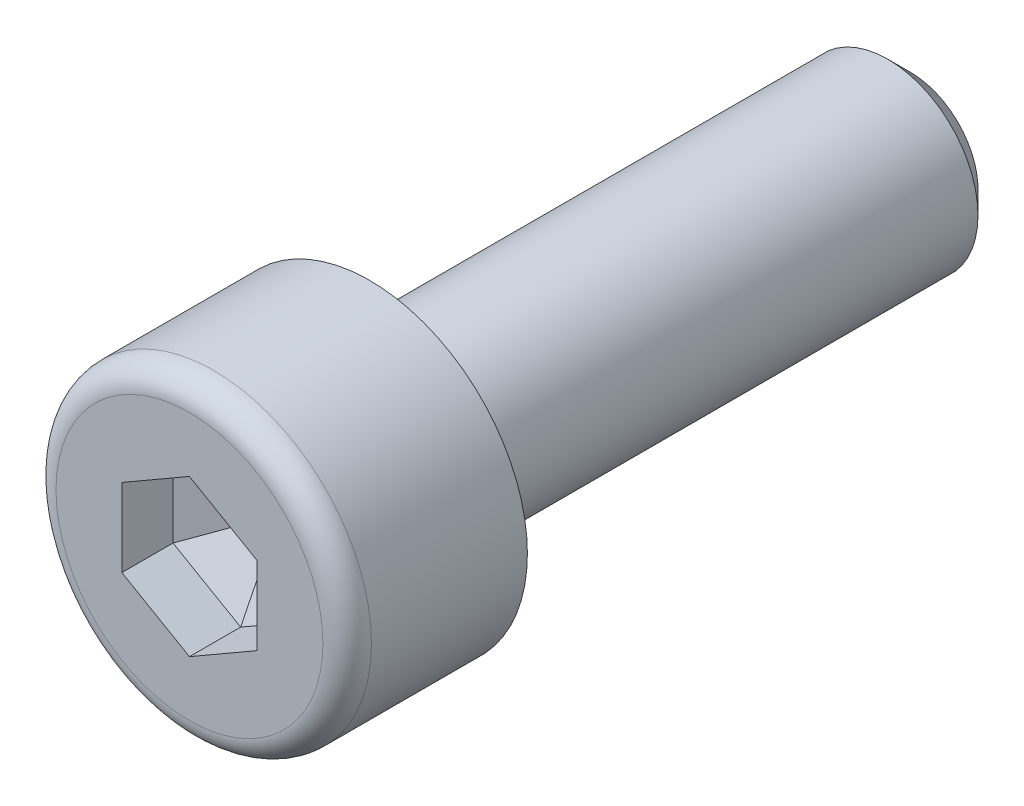
ISO-10303-21;
HEADER;
FILE_DESCRIPTION(('STEP AP214'),'2;1');
FILE_NAME('part.step','',(''),(''),'','','');
FILE_SCHEMA(('AUTOMOTIVE_DESIGN { 1 0 10303 214 1 1 1 1 }'));
ENDSEC;
DATA;
#1=APPLICATION_CONTEXT('core data for automotive mechanical design processes');
#2=APPLICATION_PROTOCOL_DEFINITION('international standard','automotive_design',2000,#1);
#3=PRODUCT_CONTEXT('',#1,'mechanical');
#4=PRODUCT('Part','Part','',(#3));
#5=PRODUCT_RELATED_PRODUCT_CATEGORY('part','',(#4));
#6=PRODUCT_DEFINITION_FORMATION('','',#4);
#7=PRODUCT_DEFINITION_CONTEXT('part definition',#1,'design');
#8=PRODUCT_DEFINITION('design','',#6,#7);
#9=PRODUCT_DEFINITION_SHAPE('','',#8);
#10=(LENGTH_UNIT() NAMED_UNIT(*) SI_UNIT(.MILLI.,.METRE.));
#11=(NAMED_UNIT(*) PLANE_ANGLE_UNIT() SI_UNIT($,.RADIAN.));
#12=(NAMED_UNIT(*) SI_UNIT($,.STERADIAN.) SOLID_ANGLE_UNIT());
#13=UNCERTAINTY_MEASURE_WITH_UNIT(LENGTH_MEASURE(1.E-05),#10,'distance_accuracy_value','');
#14=(GEOMETRIC_REPRESENTATION_CONTEXT(3) GLOBAL_UNCERTAINTY_ASSIGNED_CONTEXT((#13)) GLOBAL_UNIT_ASSIGNED_CONTEXT((#10,
#11,#12)) REPRESENTATION_CONTEXT('',''));
#15=CARTESIAN_POINT('',(0.,0.,0.));
#16=DIRECTION('',(0.,0.,1.));
#17=DIRECTION('',(1.,0.,0.));
#18=AXIS2_PLACEMENT_3D('',#15,#16,#17);
#19=CARTESIAN_POINT('',(0.,0.,0.));
#20=DIRECTION('',(0.,0.,1.));
#21=DIRECTION('',(1.,0.,0.));
#22=AXIS2_PLACEMENT_3D('',#19,#20,#21);
#23=PLANE('',#22);
#24=CARTESIAN_POINT('',(0.,0.,0.));
#25=DIRECTION('',(0.,0.,1.));
#26=DIRECTION('',(1.,0.,0.));
#27=AXIS2_PLACEMENT_3D('',#24,#25,#26);
#28=CIRCLE('',#27,2.1);
#29=CARTESIAN_POINT('',(2.1,0.,0.));
#30=VERTEX_POINT('',#29);
#31=EDGE_CURVE('E11',#30,#30,#28,.T.);
#32=ORIENTED_EDGE('',*,*,#31,.T.);
#33=EDGE_LOOP('',(#32));
#34=FACE_BOUND('',#33,.T.);
#35=CARTESIAN_POINT('',(0.,0.,0.));
#36=DIRECTION('',(0.,0.,1.));
#37=DIRECTION('',(1.,0.,0.));
#38=AXIS2_PLACEMENT_3D('',#35,#36,#37);
#39=CIRCLE('',#38,3.5);
#40=CARTESIAN_POINT('',(3.5,0.,0.));
#41=VERTEX_POINT('',#40);
#42=EDGE_CURVE('E154',#41,#41,#39,.T.);
#43=ORIENTED_EDGE('',*,*,#42,.F.);
#44=EDGE_LOOP('',(#43));
#45=FACE_BOUND('',#44,.T.);
#46=ADVANCED_FACE('F44',(#34,#45),#23,.F.);
#47=CARTESIAN_POINT('',(0.,0.,4.));
#48=DIRECTION('',(0.,0.,-1.));
#49=DIRECTION('',(-1.,0.,0.));
#50=AXIS2_PLACEMENT_3D('',#47,#48,#49);
#51=CYLINDRICAL_SURFACE('',#50,3.5);
#52=CARTESIAN_POINT('',(0.,0.,3.46153846153846));
#53=DIRECTION('',(0.,0.,1.));
#54=DIRECTION('',(1.,0.,0.));
#55=AXIS2_PLACEMENT_3D('',#52,#53,#54);
#56=CIRCLE('',#55,3.5);
#57=CARTESIAN_POINT('',(3.5,0.,3.46153846153846));
#58=VERTEX_POINT('',#57);
#59=EDGE_CURVE('E172',#58,#58,#56,.F.);
#60=ORIENTED_EDGE('',*,*,#59,.T.);
#61=EDGE_LOOP('',(#60));
#62=FACE_BOUND('',#61,.T.);
#63=ORIENTED_EDGE('',*,*,#42,.T.);
#64=EDGE_LOOP('',(#63));
#65=FACE_BOUND('',#64,.T.);
#66=ADVANCED_FACE('F231',(#62,#65),#51,.T.);
#67=CARTESIAN_POINT('',(0.,0.,4.));
#68=DIRECTION('',(0.,0.,1.));
#69=DIRECTION('',(1.,0.,0.));
#70=AXIS2_PLACEMENT_3D('',#67,#68,#69);
#71=PLANE('',#70);
#72=CARTESIAN_POINT('',(0.,0.,4.));
#73=DIRECTION('',(0.,0.,1.));
#74=DIRECTION('',(1.,0.,0.));
#75=AXIS2_PLACEMENT_3D('',#72,#73,#74);
#76=CIRCLE('',#75,2.96153846153846);
#77=CARTESIAN_POINT('',(2.96153846153846,0.,4.));
#78=VERTEX_POINT('',#77);
#79=EDGE_CURVE('E169',#78,#78,#76,.T.);
#80=ORIENTED_EDGE('',*,*,#79,.T.);
#81=EDGE_LOOP('',(#80));
#82=FACE_BOUND('',#81,.T.);
#83=DIRECTION('',(0.,1.,0.));
#84=VECTOR('',#83,1.);
#85=CARTESIAN_POINT('',(1.5,-0.866025403784439,4.));
#86=LINE('',#85,#84);
#87=CARTESIAN_POINT('',(1.5,-0.866025403784439,4.));
#88=VERTEX_POINT('',#87);
#89=CARTESIAN_POINT('',(1.5,0.866025403784439,4.));
#90=VERTEX_POINT('',#89);
#91=EDGE_CURVE('E136',#88,#90,#86,.T.);
#92=ORIENTED_EDGE('',*,*,#91,.F.);
#93=DIRECTION('',(0.866025403784439,0.5,0.));
#94=VECTOR('',#93,1.);
#95=CARTESIAN_POINT('',(0.,-1.73205080756888,4.));
#96=LINE('',#95,#94);
#97=CARTESIAN_POINT('',(0.,-1.73205080756888,4.));
#98=VERTEX_POINT('',#97);
#99=EDGE_CURVE('E149',#98,#88,#96,.T.);
#100=ORIENTED_EDGE('',*,*,#99,.F.);
#101=DIRECTION('',(0.866025403784439,-0.5,0.));
#102=VECTOR('',#101,1.);
#103=CARTESIAN_POINT('',(-1.5,-0.866025403784438,4.));
#104=LINE('',#103,#102);
#105=CARTESIAN_POINT('',(-1.5,-0.866025403784438,4.));
#106=VERTEX_POINT('',#105);
#107=EDGE_CURVE('E143',#106,#98,#104,.T.);
#108=ORIENTED_EDGE('',*,*,#107,.F.);
#109=DIRECTION('',(0.,-1.,0.));
#110=VECTOR('',#109,1.);
#111=CARTESIAN_POINT('',(-1.5,0.866025403784439,4.));
#112=LINE('',#111,#110);
#113=CARTESIAN_POINT('',(-1.5,0.866025403784439,4.));
#114=VERTEX_POINT('',#113);
#115=EDGE_CURVE('E141',#114,#106,#112,.T.);
#116=ORIENTED_EDGE('',*,*,#115,.F.);
#117=DIRECTION('',(-0.866025403784439,-0.5,0.));
#118=VECTOR('',#117,1.);
#119=CARTESIAN_POINT('',(0.,1.73205080756888,4.));
#120=LINE('',#119,#118);
#121=CARTESIAN_POINT('',(0.,1.73205080756888,4.));
#122=VERTEX_POINT('',#121);
#123=EDGE_CURVE('E121',#122,#114,#120,.T.);
#124=ORIENTED_EDGE('',*,*,#123,.F.);
#125=DIRECTION('',(-0.866025403784439,0.5,0.));
#126=VECTOR('',#125,1.);
#127=CARTESIAN_POINT('',(1.5,0.866025403784439,4.));
#128=LINE('',#127,#126);
#129=EDGE_CURVE('E131',#90,#122,#128,.T.);
#130=ORIENTED_EDGE('',*,*,#129,.F.);
#131=EDGE_LOOP('',(#92,#100,#108,#116,#124,#130));
#132=FACE_BOUND('',#131,.T.);
#133=ADVANCED_FACE('F138',(#82,#132),#71,.T.);
#134=CARTESIAN_POINT('',(1.5,-0.866025403784439,2.));
#135=DIRECTION('',(1.,0.,0.));
#136=DIRECTION('',(0.,1.,0.));
#137=AXIS2_PLACEMENT_3D('',#134,#135,#136);
#138=PLANE('',#137);
#139=DIRECTION('',(0.,0.,1.));
#140=VECTOR('',#139,1.);
#141=CARTESIAN_POINT('',(1.5,0.866025403784439,2.));
#142=LINE('',#141,#140);
#143=CARTESIAN_POINT('',(1.5,0.866025403784439,2.86455331412104));
#144=VERTEX_POINT('',#143);
#145=EDGE_CURVE('E128',#144,#90,#142,.T.);
#146=ORIENTED_EDGE('',*,*,#145,.F.);
#147=DIRECTION('',(0.,-1.,0.));
#148=VECTOR('',#147,1.);
#149=CARTESIAN_POINT('',(1.5,-0.866025403784439,2.86455331412104));
#150=LINE('',#149,#148);
#151=CARTESIAN_POINT('',(1.5,-0.866025403784439,2.86455331412104));
#152=VERTEX_POINT('',#151);
#153=EDGE_CURVE('E67',#144,#152,#150,.T.);
#154=ORIENTED_EDGE('',*,*,#153,.T.);
#155=DIRECTION('',(0.,0.,1.));
#156=VECTOR('',#155,1.);
#157=CARTESIAN_POINT('',(1.5,-0.866025403784439,2.));
#158=LINE('',#157,#156);
#159=EDGE_CURVE('E152',#152,#88,#158,.T.);
#160=ORIENTED_EDGE('',*,*,#159,.T.);
#161=ORIENTED_EDGE('',*,*,#91,.T.);
#162=EDGE_LOOP('',(#146,#154,#160,#161));
#163=FACE_BOUND('',#162,.T.);
#164=ADVANCED_FACE('F291',(#163),#138,.F.);
#165=CARTESIAN_POINT('',(0.,-1.73205080756888,2.));
#166=DIRECTION('',(0.5,-0.866025403784439,0.));
#167=DIRECTION('',(0.866025403784439,0.5,0.));
#168=AXIS2_PLACEMENT_3D('',#165,#166,#167);
#169=PLANE('',#168);
#170=ORIENTED_EDGE('',*,*,#159,.F.);
#171=DIRECTION('',(-0.866025403784439,-0.5,0.));
#172=VECTOR('',#171,1.);
#173=CARTESIAN_POINT('',(0.,-1.73205080756888,2.86455331412104));
#174=LINE('',#173,#172);
#175=CARTESIAN_POINT('',(0.,-1.73205080756888,2.86455331412104));
#176=VERTEX_POINT('',#175);
#177=EDGE_CURVE('E59',#152,#176,#174,.T.);
#178=ORIENTED_EDGE('',*,*,#177,.T.);
#179=DIRECTION('',(0.,0.,1.));
#180=VECTOR('',#179,1.);
#181=CARTESIAN_POINT('',(0.,-1.73205080756888,2.));
#182=LINE('',#181,#180);
#183=EDGE_CURVE('E155',#176,#98,#182,.T.);
#184=ORIENTED_EDGE('',*,*,#183,.T.);
#185=ORIENTED_EDGE('',*,*,#99,.T.);
#186=EDGE_LOOP('',(#170,#178,#184,#185));
#187=FACE_BOUND('',#186,.T.);
#188=ADVANCED_FACE('F293',(#187),#169,.F.);
#189=CARTESIAN_POINT('',(-1.5,-0.866025403784438,2.));
#190=DIRECTION('',(-0.5,-0.866025403784439,0.));
#191=DIRECTION('',(0.866025403784439,-0.5,0.));
#192=AXIS2_PLACEMENT_3D('',#189,#190,#191);
#193=PLANE('',#192);
#194=ORIENTED_EDGE('',*,*,#183,.F.);
#195=DIRECTION('',(-0.866025403784439,0.5,0.));
#196=VECTOR('',#195,1.);
#197=CARTESIAN_POINT('',(-1.5,-0.866025403784438,2.86455331412104));
#198=LINE('',#197,#196);
#199=CARTESIAN_POINT('',(-1.5,-0.866025403784438,2.86455331412104));
#200=VERTEX_POINT('',#199);
#201=EDGE_CURVE('E195',#176,#200,#198,.T.);
#202=ORIENTED_EDGE('',*,*,#201,.T.);
#203=DIRECTION('',(0.,0.,1.));
#204=VECTOR('',#203,1.);
#205=CARTESIAN_POINT('',(-1.5,-0.866025403784438,2.));
#206=LINE('',#205,#204);
#207=EDGE_CURVE('E157',#200,#106,#206,.T.);
#208=ORIENTED_EDGE('',*,*,#207,.T.);
#209=ORIENTED_EDGE('',*,*,#107,.T.);
#210=EDGE_LOOP('',(#194,#202,#208,#209));
#211=FACE_BOUND('',#210,.T.);
#212=ADVANCED_FACE('F282',(#211),#193,.F.);
#213=CARTESIAN_POINT('',(-1.5,0.866025403784439,2.));
#214=DIRECTION('',(-1.,0.,0.));
#215=DIRECTION('',(0.,0.,1.));
#216=AXIS2_PLACEMENT_3D('',#213,#214,#215);
#217=PLANE('',#216);
#218=ORIENTED_EDGE('',*,*,#207,.F.);
#219=DIRECTION('',(0.,1.,0.));
#220=VECTOR('',#219,1.);
#221=CARTESIAN_POINT('',(-1.5,0.866025403784439,2.86455331412104));
#222=LINE('',#221,#220);
#223=CARTESIAN_POINT('',(-1.5,0.866025403784439,2.86455331412104));
#224=VERTEX_POINT('',#223);
#225=EDGE_CURVE('E188',#200,#224,#222,.T.);
#226=ORIENTED_EDGE('',*,*,#225,.T.);
#227=DIRECTION('',(0.,0.,1.));
#228=VECTOR('',#227,1.);
#229=CARTESIAN_POINT('',(-1.5,0.866025403784439,2.));
#230=LINE('',#229,#228);
#231=EDGE_CURVE('E127',#224,#114,#230,.T.);
#232=ORIENTED_EDGE('',*,*,#231,.T.);
#233=ORIENTED_EDGE('',*,*,#115,.T.);
#234=EDGE_LOOP('',(#218,#226,#232,#233));
#235=FACE_BOUND('',#234,.T.);
#236=ADVANCED_FACE('F285',(#235),#217,.F.);
#237=CARTESIAN_POINT('',(0.,1.73205080756888,2.));
#238=DIRECTION('',(-0.5,0.866025403784439,0.));
#239=DIRECTION('',(-0.866025403784439,-0.5,0.));
#240=AXIS2_PLACEMENT_3D('',#237,#238,#239);
#241=PLANE('',#240);
#242=ORIENTED_EDGE('',*,*,#231,.F.);
#243=DIRECTION('',(0.866025403784439,0.5,0.));
#244=VECTOR('',#243,1.);
#245=CARTESIAN_POINT('',(0.,1.73205080756888,2.86455331412104));
#246=LINE('',#245,#244);
#247=CARTESIAN_POINT('',(0.,1.73205080756888,2.86455331412104));
#248=VERTEX_POINT('',#247);
#249=EDGE_CURVE('E124',#224,#248,#246,.T.);
#250=ORIENTED_EDGE('',*,*,#249,.T.);
#251=DIRECTION('',(0.,0.,1.));
#252=VECTOR('',#251,1.);
#253=CARTESIAN_POINT('',(0.,1.73205080756888,2.));
#254=LINE('',#253,#252);
#255=EDGE_CURVE('E116',#248,#122,#254,.T.);
#256=ORIENTED_EDGE('',*,*,#255,.T.);
#257=ORIENTED_EDGE('',*,*,#123,.T.);
#258=EDGE_LOOP('',(#242,#250,#256,#257));
#259=FACE_BOUND('',#258,.T.);
#260=ADVANCED_FACE('F119',(#259),#241,.F.);
#261=CARTESIAN_POINT('',(1.5,0.866025403784439,2.));
#262=DIRECTION('',(0.5,0.866025403784439,0.));
#263=DIRECTION('',(-0.866025403784439,0.5,0.));
#264=AXIS2_PLACEMENT_3D('',#261,#262,#263);
#265=PLANE('',#264);
#266=ORIENTED_EDGE('',*,*,#255,.F.);
#267=DIRECTION('',(0.866025403784439,-0.5,0.));
#268=VECTOR('',#267,1.);
#269=CARTESIAN_POINT('',(1.5,0.866025403784439,2.86455331412104));
#270=LINE('',#269,#268);
#271=EDGE_CURVE('E192',#248,#144,#270,.T.);
#272=ORIENTED_EDGE('',*,*,#271,.T.);
#273=ORIENTED_EDGE('',*,*,#145,.T.);
#274=ORIENTED_EDGE('',*,*,#129,.T.);
#275=EDGE_LOOP('',(#266,#272,#273,#274));
#276=FACE_BOUND('',#275,.T.);
#277=ADVANCED_FACE('F132',(#276),#265,.F.);
#278=CARTESIAN_POINT('',(0.,0.,2.));
#279=DIRECTION('',(0.,0.,1.));
#280=DIRECTION('',(1.,0.,0.));
#281=AXIS2_PLACEMENT_3D('',#278,#279,#280);
#282=PLANE('',#281);
#283=DIRECTION('',(-0.866025403784439,-0.5,0.));
#284=VECTOR('',#283,1.);
#285=CARTESIAN_POINT('',(-0.00127486704514497,0.00220813449508629,2.));
#286=LINE('',#285,#284);
#287=CARTESIAN_POINT('',(0.,0.00294417932678217,2.));
#288=VERTEX_POINT('',#287);
#289=CARTESIAN_POINT('',(-0.0025497340902902,0.00147208966339069,2.));
#290=VERTEX_POINT('',#289);
#291=EDGE_CURVE('E183',#288,#290,#286,.T.);
#292=ORIENTED_EDGE('',*,*,#291,.T.);
#293=DIRECTION('',(0.,-1.,0.));
#294=VECTOR('',#293,1.);
#295=CARTESIAN_POINT('',(-0.0025497340902902,0.,2.));
#296=LINE('',#295,#294);
#297=CARTESIAN_POINT('',(-0.0025497340902902,-0.00147208966339015,2.));
#298=VERTEX_POINT('',#297);
#299=EDGE_CURVE('E185',#290,#298,#296,.T.);
#300=ORIENTED_EDGE('',*,*,#299,.T.);
#301=DIRECTION('',(0.866025403784439,-0.5,0.));
#302=VECTOR('',#301,1.);
#303=CARTESIAN_POINT('',(-0.00127486704514472,-0.00220813449508586,2.));
#304=LINE('',#303,#302);
#305=CARTESIAN_POINT('',(0.,-0.00294417932678155,2.));
#306=VERTEX_POINT('',#305);
#307=EDGE_CURVE('E177',#298,#306,#304,.T.);
#308=ORIENTED_EDGE('',*,*,#307,.T.);
#309=DIRECTION('',(0.866025403784439,0.5,0.));
#310=VECTOR('',#309,1.);
#311=CARTESIAN_POINT('',(0.00127486704514505,-0.00220813449508643,2.));
#312=LINE('',#311,#310);
#313=CARTESIAN_POINT('',(0.0025497340902899,-0.00147208966339111,2.));
#314=VERTEX_POINT('',#313);
#315=EDGE_CURVE('E175',#306,#314,#312,.T.);
#316=ORIENTED_EDGE('',*,*,#315,.T.);
#317=DIRECTION('',(0.,1.,0.));
#318=VECTOR('',#317,1.);
#319=CARTESIAN_POINT('',(0.00254973409028988,0.,2.));
#320=LINE('',#319,#318);
#321=CARTESIAN_POINT('',(0.00254973409028988,0.00147208966339182,2.));
#322=VERTEX_POINT('',#321);
#323=EDGE_CURVE('E179',#314,#322,#320,.T.);
#324=ORIENTED_EDGE('',*,*,#323,.T.);
#325=DIRECTION('',(-0.866025403784439,0.5,0.));
#326=VECTOR('',#325,1.);
#327=CARTESIAN_POINT('',(0.00127486704514537,0.00220813449508699,2.));
#328=LINE('',#327,#326);
#329=EDGE_CURVE('E181',#322,#288,#328,.T.);
#330=ORIENTED_EDGE('',*,*,#329,.T.);
#331=EDGE_LOOP('',(#292,#300,#308,#316,#324,#330));
#332=FACE_BOUND('',#331,.T.);
#333=ADVANCED_FACE('F302',(#332),#282,.T.);
#334=CARTESIAN_POINT('',(0.,0.,-12.));
#335=DIRECTION('',(0.,0.,1.));
#336=DIRECTION('',(1.,0.,0.));
#337=AXIS2_PLACEMENT_3D('',#334,#335,#336);
#338=CYLINDRICAL_SURFACE('',#337,2.);
#339=CARTESIAN_POINT('',(0.,0.,-0.0999999999999994));
#340=DIRECTION('',(0.,0.,1.));
#341=DIRECTION('',(1.,0.,0.));
#342=AXIS2_PLACEMENT_3D('',#339,#340,#341);
#343=CIRCLE('',#342,2.);
#344=CARTESIAN_POINT('',(2.,0.,-0.0999999999999994));
#345=VERTEX_POINT('',#344);
#346=EDGE_CURVE('E52',#345,#345,#343,.F.);
#347=ORIENTED_EDGE('',*,*,#346,.T.);
#348=EDGE_LOOP('',(#347));
#349=FACE_BOUND('',#348,.T.);
#350=CARTESIAN_POINT('',(0.,0.,-11.5));
#351=DIRECTION('',(0.,0.,-1.));
#352=DIRECTION('',(-1.,0.,0.));
#353=AXIS2_PLACEMENT_3D('',#350,#351,#352);
#354=CIRCLE('',#353,2.);
#355=CARTESIAN_POINT('',(-2.,0.,-11.5));
#356=VERTEX_POINT('',#355);
#357=EDGE_CURVE('E166',#356,#356,#354,.F.);
#358=ORIENTED_EDGE('',*,*,#357,.T.);
#359=EDGE_LOOP('',(#358));
#360=FACE_BOUND('',#359,.T.);
#361=ADVANCED_FACE('F216',(#349,#360),#338,.T.);
#362=CARTESIAN_POINT('',(0.,0.,-12.));
#363=DIRECTION('',(0.,0.,-1.));
#364=DIRECTION('',(-1.,0.,0.));
#365=AXIS2_PLACEMENT_3D('',#362,#363,#364);
#366=PLANE('',#365);
#367=CARTESIAN_POINT('',(0.,0.,-12.));
#368=DIRECTION('',(0.,0.,-1.));
#369=DIRECTION('',(-1.,0.,0.));
#370=AXIS2_PLACEMENT_3D('',#367,#368,#369);
#371=CIRCLE('',#370,1.5);
#372=CARTESIAN_POINT('',(-1.5,0.,-12.));
#373=VERTEX_POINT('',#372);
#374=EDGE_CURVE('E163',#373,#373,#371,.T.);
#375=ORIENTED_EDGE('',*,*,#374,.T.);
#376=EDGE_LOOP('',(#375));
#377=FACE_BOUND('',#376,.T.);
#378=ADVANCED_FACE('F247',(#377),#366,.T.);
#379=CARTESIAN_POINT('',(0.,0.,-12.));
#380=DIRECTION('',(0.,0.,1.));
#381=DIRECTION('',(1.,0.,0.));
#382=AXIS2_PLACEMENT_3D('',#379,#380,#381);
#383=CONICAL_SURFACE('',#382,1.5,0.785398163397448);
#384=ORIENTED_EDGE('',*,*,#357,.F.);
#385=EDGE_LOOP('',(#384));
#386=FACE_BOUND('',#385,.T.);
#387=ORIENTED_EDGE('',*,*,#374,.F.);
#388=EDGE_LOOP('',(#387));
#389=FACE_BOUND('',#388,.T.);
#390=ADVANCED_FACE('F243',(#386,#389),#383,.T.);
#391=CARTESIAN_POINT('',(0.,0.,3.46153846153846));
#392=DIRECTION('',(0.,0.,1.));
#393=DIRECTION('',(1.,0.,0.));
#394=AXIS2_PLACEMENT_3D('',#391,#392,#393);
#395=TOROIDAL_SURFACE('',#394,2.96153846153846,0.538461538461538);
#396=ORIENTED_EDGE('',*,*,#59,.F.);
#397=EDGE_LOOP('',(#396));
#398=FACE_BOUND('',#397,.T.);
#399=ORIENTED_EDGE('',*,*,#79,.F.);
#400=EDGE_LOOP('',(#399));
#401=FACE_BOUND('',#400,.T.);
#402=ADVANCED_FACE('F246',(#398,#401),#395,.T.);
#403=CARTESIAN_POINT('',(0.00254973409028988,0.,2.));
#404=DIRECTION('',(0.499999999999995,0.,-0.866025403784442));
#405=DIRECTION('',(0.,1.,0.));
#406=AXIS2_PLACEMENT_3D('',#403,#404,#405);
#407=PLANE('',#406);
#408=DIRECTION('',(-0.774596669241486,0.447213595499959,-0.447213595499953));
#409=VECTOR('',#408,1.);
#410=CARTESIAN_POINT('',(0.00203978727223181,-0.00117767173071286,1.99970558206732));
#411=LINE('',#410,#409);
#412=EDGE_CURVE('E208',#152,#314,#411,.T.);
#413=ORIENTED_EDGE('',*,*,#412,.F.);
#414=ORIENTED_EDGE('',*,*,#153,.F.);
#415=DIRECTION('',(-0.774596669241486,-0.447213595499959,-0.447213595499953));
#416=VECTOR('',#415,1.);
#417=CARTESIAN_POINT('',(0.00203978727223207,0.00117767173071376,1.99970558206732));
#418=LINE('',#417,#416);
#419=EDGE_CURVE('E211',#322,#144,#418,.F.);
#420=ORIENTED_EDGE('',*,*,#419,.F.);
#421=ORIENTED_EDGE('',*,*,#323,.F.);
#422=EDGE_LOOP('',(#413,#414,#420,#421));
#423=FACE_BOUND('',#422,.T.);
#424=ADVANCED_FACE('F250',(#423),#407,.F.);
#425=CARTESIAN_POINT('',(0.00127486704514537,0.00220813449508699,2.));
#426=DIRECTION('',(0.249999999999997,0.433012701892215,-0.866025403784442));
#427=DIRECTION('',(-0.866025403784439,0.5,0.));
#428=AXIS2_PLACEMENT_3D('',#425,#426,#427);
#429=PLANE('',#428);
#430=ORIENTED_EDGE('',*,*,#419,.T.);
#431=ORIENTED_EDGE('',*,*,#271,.F.);
#432=DIRECTION('',(0.,-0.894427190999918,-0.447213595499953));
#433=VECTOR('',#432,1.);
#434=CARTESIAN_POINT('',(0.,0.00235534346142542,1.99970558206732));
#435=LINE('',#434,#433);
#436=EDGE_CURVE('E205',#288,#248,#435,.F.);
#437=ORIENTED_EDGE('',*,*,#436,.F.);
#438=ORIENTED_EDGE('',*,*,#329,.F.);
#439=EDGE_LOOP('',(#430,#431,#437,#438));
#440=FACE_BOUND('',#439,.T.);
#441=ADVANCED_FACE('F263',(#440),#429,.F.);
#442=CARTESIAN_POINT('',(0.00127486704514505,-0.00220813449508643,2.));
#443=DIRECTION('',(0.249999999999997,-0.433012701892215,-0.866025403784442));
#444=DIRECTION('',(0.866025403784439,0.5,0.));
#445=AXIS2_PLACEMENT_3D('',#442,#443,#444);
#446=PLANE('',#445);
#447=ORIENTED_EDGE('',*,*,#412,.T.);
#448=ORIENTED_EDGE('',*,*,#315,.F.);
#449=DIRECTION('',(0.,-0.894427190999918,0.447213595499953));
#450=VECTOR('',#449,1.);
#451=CARTESIAN_POINT('',(0.,-0.00235534346142499,1.99970558206732));
#452=LINE('',#451,#450);
#453=EDGE_CURVE('E202',#176,#306,#452,.F.);
#454=ORIENTED_EDGE('',*,*,#453,.F.);
#455=ORIENTED_EDGE('',*,*,#177,.F.);
#456=EDGE_LOOP('',(#447,#448,#454,#455));
#457=FACE_BOUND('',#456,.T.);
#458=ADVANCED_FACE('F259',(#457),#446,.F.);
#459=CARTESIAN_POINT('',(-0.00127486704514494,0.00220813449508624,2.));
#460=DIRECTION('',(-0.249999999999997,0.433012701892215,-0.866025403784442));
#461=DIRECTION('',(-0.866025403784439,-0.5,0.));
#462=AXIS2_PLACEMENT_3D('',#459,#460,#461);
#463=PLANE('',#462);
#464=ORIENTED_EDGE('',*,*,#436,.T.);
#465=ORIENTED_EDGE('',*,*,#249,.F.);
#466=DIRECTION('',(0.774596669241485,-0.44721359549996,-0.447213595499953));
#467=VECTOR('',#466,1.);
#468=CARTESIAN_POINT('',(-0.00203978727223229,0.00117767173071251,1.99970558206732));
#469=LINE('',#468,#467);
#470=EDGE_CURVE('E200',#290,#224,#469,.F.);
#471=ORIENTED_EDGE('',*,*,#470,.F.);
#472=ORIENTED_EDGE('',*,*,#291,.F.);
#473=EDGE_LOOP('',(#464,#465,#471,#472));
#474=FACE_BOUND('',#473,.T.);
#475=ADVANCED_FACE('F255',(#474),#463,.F.);
#476=CARTESIAN_POINT('',(-0.00127486704514472,-0.00220813449508586,2.));
#477=DIRECTION('',(-0.249999999999997,-0.433012701892215,-0.866025403784442));
#478=DIRECTION('',(0.866025403784439,-0.5,0.));
#479=AXIS2_PLACEMENT_3D('',#476,#477,#478);
#480=PLANE('',#479);
#481=ORIENTED_EDGE('',*,*,#453,.T.);
#482=ORIENTED_EDGE('',*,*,#307,.F.);
#483=DIRECTION('',(-0.774596669241485,-0.447213595499959,0.447213595499953));
#484=VECTOR('',#483,1.);
#485=CARTESIAN_POINT('',(-0.00203978727223246,-0.00117767173071211,1.99970558206732));
#486=LINE('',#485,#484);
#487=EDGE_CURVE('E198',#200,#298,#486,.F.);
#488=ORIENTED_EDGE('',*,*,#487,.F.);
#489=ORIENTED_EDGE('',*,*,#201,.F.);
#490=EDGE_LOOP('',(#481,#482,#488,#489));
#491=FACE_BOUND('',#490,.T.);
#492=ADVANCED_FACE('F226',(#491),#480,.F.);
#493=CARTESIAN_POINT('',(-0.0025497340902902,0.,2.));
#494=DIRECTION('',(-0.499999999999995,0.,-0.866025403784442));
#495=DIRECTION('',(0.,-1.,0.));
#496=AXIS2_PLACEMENT_3D('',#493,#494,#495);
#497=PLANE('',#496);
#498=ORIENTED_EDGE('',*,*,#470,.T.);
#499=ORIENTED_EDGE('',*,*,#225,.F.);
#500=ORIENTED_EDGE('',*,*,#487,.T.);
#501=ORIENTED_EDGE('',*,*,#299,.F.);
#502=EDGE_LOOP('',(#498,#499,#500,#501));
#503=FACE_BOUND('',#502,.T.);
#504=ADVANCED_FACE('F220',(#503),#497,.F.);
#505=CARTESIAN_POINT('',(0.,0.,-0.0999999999999994));
#506=DIRECTION('',(0.,0.,1.));
#507=DIRECTION('',(1.,0.,0.));
#508=AXIS2_PLACEMENT_3D('',#505,#506,#507);
#509=TOROIDAL_SURFACE('',#508,2.1,0.1);
#510=ORIENTED_EDGE('',*,*,#31,.F.);
#511=EDGE_LOOP('',(#510));
#512=FACE_BOUND('',#511,.T.);
#513=ORIENTED_EDGE('',*,*,#346,.F.);
#514=EDGE_LOOP('',(#513));
#515=FACE_BOUND('',#514,.T.);
#516=ADVANCED_FACE('F46',(#512,#515),#509,.F.);
#517=CLOSED_SHELL('',(#46,#66,#133,#164,#188,#212,#236,#260,#277,#333,#361,#378,#390,#402,#424,
#441,#458,#475,#492,#504,#516));
#518=MANIFOLD_SOLID_BREP('B2',#517);
#519=ADVANCED_BREP_SHAPE_REPRESENTATION('',(#18,#518),#14);
#520=SHAPE_DEFINITION_REPRESENTATION(#9,#519);
ENDSEC;
END-ISO-10303-21;
